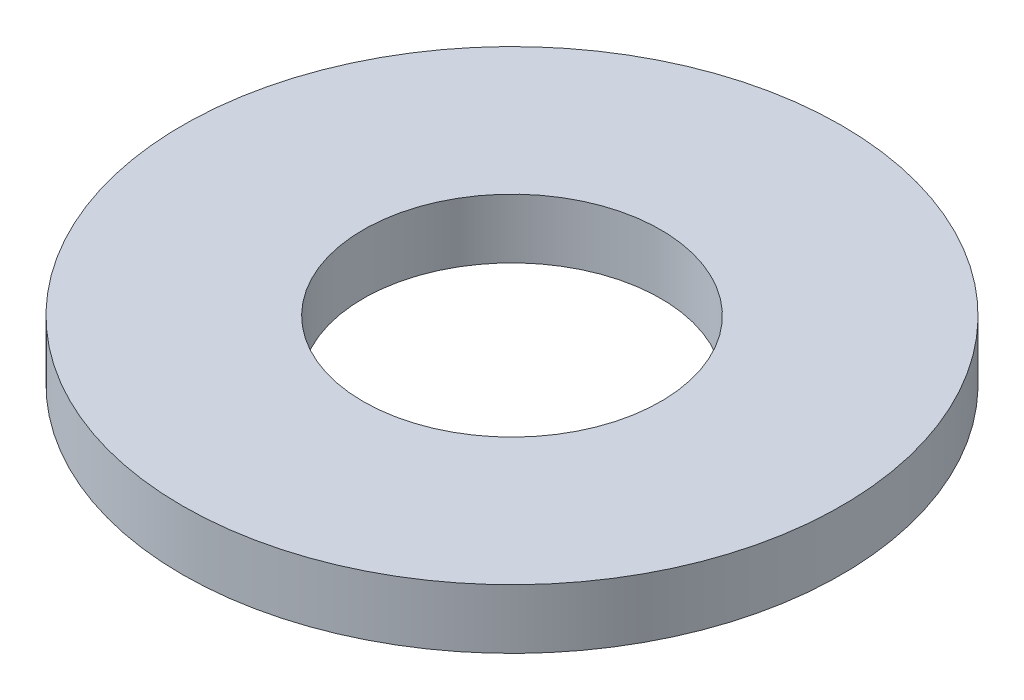
ISO-10303-21;
HEADER;
FILE_DESCRIPTION(('STEP AP214'),'2;1');
FILE_NAME('part.step','',(''),(''),'','','');
FILE_SCHEMA(('AUTOMOTIVE_DESIGN { 1 0 10303 214 1 1 1 1 }'));
ENDSEC;
DATA;
#1=APPLICATION_CONTEXT('core data for automotive mechanical design processes');
#2=APPLICATION_PROTOCOL_DEFINITION('international standard','automotive_design',2000,#1);
#3=PRODUCT_CONTEXT('',#1,'mechanical');
#4=PRODUCT('Part','Part','',(#3));
#5=PRODUCT_RELATED_PRODUCT_CATEGORY('part','',(#4));
#6=PRODUCT_DEFINITION_FORMATION('','',#4);
#7=PRODUCT_DEFINITION_CONTEXT('part definition',#1,'design');
#8=PRODUCT_DEFINITION('design','',#6,#7);
#9=PRODUCT_DEFINITION_SHAPE('','',#8);
#10=(LENGTH_UNIT() NAMED_UNIT(*) SI_UNIT(.MILLI.,.METRE.));
#11=(NAMED_UNIT(*) PLANE_ANGLE_UNIT() SI_UNIT($,.RADIAN.));
#12=(NAMED_UNIT(*) SI_UNIT($,.STERADIAN.) SOLID_ANGLE_UNIT());
#13=UNCERTAINTY_MEASURE_WITH_UNIT(LENGTH_MEASURE(1.E-05),#10,'distance_accuracy_value','');
#14=(GEOMETRIC_REPRESENTATION_CONTEXT(3) GLOBAL_UNCERTAINTY_ASSIGNED_CONTEXT((#13)) GLOBAL_UNIT_ASSIGNED_CONTEXT((#10,
#11,#12)) REPRESENTATION_CONTEXT('',''));
#15=CARTESIAN_POINT('',(0.,0.,0.));
#16=DIRECTION('',(0.,0.,1.));
#17=DIRECTION('',(1.,0.,0.));
#18=AXIS2_PLACEMENT_3D('',#15,#16,#17);
#19=CARTESIAN_POINT('',(0.,2.,0.));
#20=DIRECTION('',(0.,1.,0.));
#21=DIRECTION('',(0.,0.,1.));
#22=AXIS2_PLACEMENT_3D('',#19,#20,#21);
#23=PLANE('',#22);
#24=CARTESIAN_POINT('',(0.,2.,0.));
#25=DIRECTION('',(0.,1.,0.));
#26=DIRECTION('',(0.,0.,1.));
#27=AXIS2_PLACEMENT_3D('',#24,#25,#26);
#28=CIRCLE('',#27,11.075);
#29=CARTESIAN_POINT('',(0.,2.,11.075));
#30=VERTEX_POINT('',#29);
#31=EDGE_CURVE('E10',#30,#30,#28,.T.);
#32=ORIENTED_EDGE('',*,*,#31,.T.);
#33=EDGE_LOOP('',(#32));
#34=FACE_BOUND('',#33,.T.);
#35=CARTESIAN_POINT('',(0.,2.,0.));
#36=DIRECTION('',(0.,1.,0.));
#37=DIRECTION('',(0.,0.,1.));
#38=AXIS2_PLACEMENT_3D('',#35,#36,#37);
#39=CIRCLE('',#38,5.);
#40=CARTESIAN_POINT('',(0.,2.,5.));
#41=VERTEX_POINT('',#40);
#42=EDGE_CURVE('E50',#41,#41,#39,.T.);
#43=ORIENTED_EDGE('',*,*,#42,.F.);
#44=EDGE_LOOP('',(#43));
#45=FACE_BOUND('',#44,.T.);
#46=ADVANCED_FACE('F37',(#34,#45),#23,.T.);
#47=CARTESIAN_POINT('',(0.,0.,0.));
#48=DIRECTION('',(0.,1.,0.));
#49=DIRECTION('',(0.,0.,1.));
#50=AXIS2_PLACEMENT_3D('',#47,#48,#49);
#51=PLANE('',#50);
#52=CARTESIAN_POINT('',(0.,0.,0.));
#53=DIRECTION('',(0.,1.,0.));
#54=DIRECTION('',(0.,0.,1.));
#55=AXIS2_PLACEMENT_3D('',#52,#53,#54);
#56=CIRCLE('',#55,11.075);
#57=CARTESIAN_POINT('',(0.,0.,11.075));
#58=VERTEX_POINT('',#57);
#59=EDGE_CURVE('E41',#58,#58,#56,.T.);
#60=ORIENTED_EDGE('',*,*,#59,.F.);
#61=EDGE_LOOP('',(#60));
#62=FACE_BOUND('',#61,.T.);
#63=CARTESIAN_POINT('',(0.,0.,0.));
#64=DIRECTION('',(0.,1.,0.));
#65=DIRECTION('',(0.,0.,1.));
#66=AXIS2_PLACEMENT_3D('',#63,#64,#65);
#67=CIRCLE('',#66,5.);
#68=CARTESIAN_POINT('',(0.,0.,5.));
#69=VERTEX_POINT('',#68);
#70=EDGE_CURVE('E52',#69,#69,#67,.T.);
#71=ORIENTED_EDGE('',*,*,#70,.T.);
#72=EDGE_LOOP('',(#71));
#73=FACE_BOUND('',#72,.T.);
#74=ADVANCED_FACE('F64',(#62,#73),#51,.F.);
#75=CARTESIAN_POINT('',(0.,2.,0.));
#76=DIRECTION('',(0.,-1.,0.));
#77=DIRECTION('',(0.,0.,-1.));
#78=AXIS2_PLACEMENT_3D('',#75,#76,#77);
#79=CYLINDRICAL_SURFACE('',#78,11.075);
#80=ORIENTED_EDGE('',*,*,#31,.F.);
#81=EDGE_LOOP('',(#80));
#82=FACE_BOUND('',#81,.T.);
#83=ORIENTED_EDGE('',*,*,#59,.T.);
#84=EDGE_LOOP('',(#83));
#85=FACE_BOUND('',#84,.T.);
#86=ADVANCED_FACE('F39',(#82,#85),#79,.T.);
#87=CARTESIAN_POINT('',(0.,2.,0.));
#88=DIRECTION('',(0.,-1.,0.));
#89=DIRECTION('',(0.,0.,-1.));
#90=AXIS2_PLACEMENT_3D('',#87,#88,#89);
#91=CYLINDRICAL_SURFACE('',#90,5.);
#92=ORIENTED_EDGE('',*,*,#42,.T.);
#93=EDGE_LOOP('',(#92));
#94=FACE_BOUND('',#93,.T.);
#95=ORIENTED_EDGE('',*,*,#70,.F.);
#96=EDGE_LOOP('',(#95));
#97=FACE_BOUND('',#96,.T.);
#98=ADVANCED_FACE('F60',(#94,#97),#91,.F.);
#99=CLOSED_SHELL('',(#46,#74,#86,#98));
#100=MANIFOLD_SOLID_BREP('B2',#99);
#101=ADVANCED_BREP_SHAPE_REPRESENTATION('',(#18,#100),#14);
#102=SHAPE_DEFINITION_REPRESENTATION(#9,#101);
ENDSEC;
END-ISO-10303-21;
